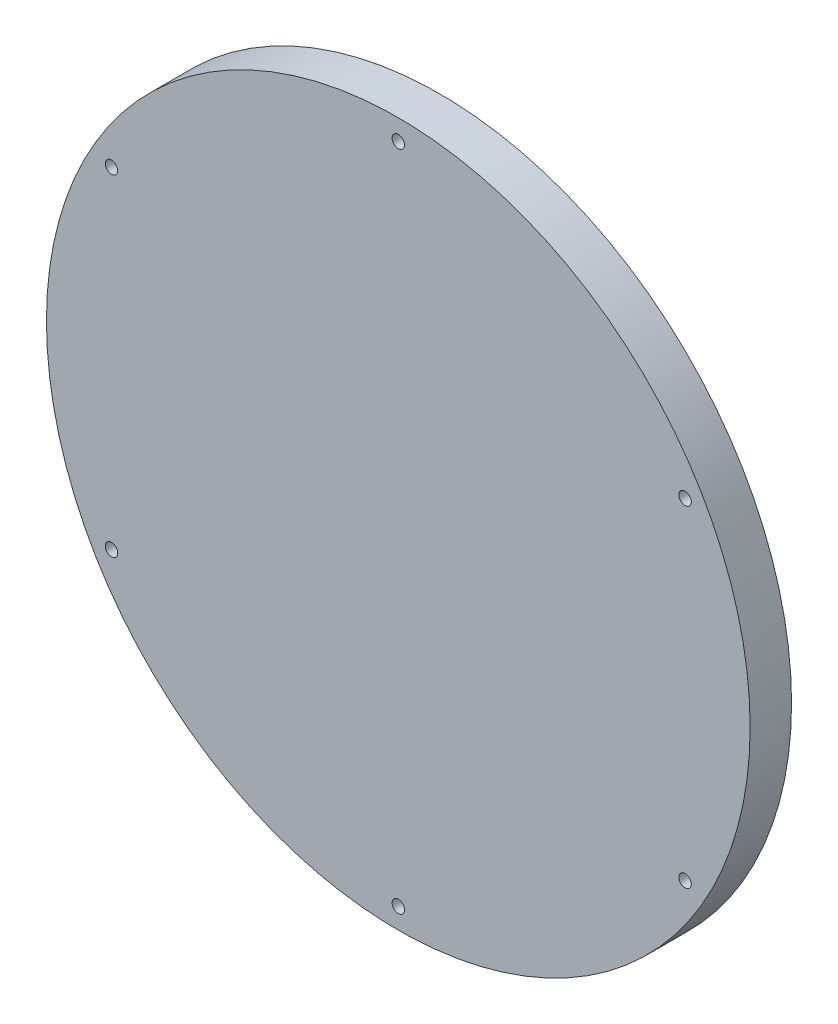
ISO-10303-21;
HEADER;
FILE_DESCRIPTION(('STEP AP214'),'2;1');
FILE_NAME('part.step','',(''),(''),'','','');
FILE_SCHEMA(('AUTOMOTIVE_DESIGN { 1 0 10303 214 1 1 1 1 }'));
ENDSEC;
DATA;
#1=APPLICATION_CONTEXT('core data for automotive mechanical design processes');
#2=APPLICATION_PROTOCOL_DEFINITION('international standard','automotive_design',2000,#1);
#3=PRODUCT_CONTEXT('',#1,'mechanical');
#4=PRODUCT('Part','Part','',(#3));
#5=PRODUCT_RELATED_PRODUCT_CATEGORY('part','',(#4));
#6=PRODUCT_DEFINITION_FORMATION('','',#4);
#7=PRODUCT_DEFINITION_CONTEXT('part definition',#1,'design');
#8=PRODUCT_DEFINITION('design','',#6,#7);
#9=PRODUCT_DEFINITION_SHAPE('','',#8);
#10=(LENGTH_UNIT() NAMED_UNIT(*) SI_UNIT(.MILLI.,.METRE.));
#11=(NAMED_UNIT(*) PLANE_ANGLE_UNIT() SI_UNIT($,.RADIAN.));
#12=(NAMED_UNIT(*) SI_UNIT($,.STERADIAN.) SOLID_ANGLE_UNIT());
#13=UNCERTAINTY_MEASURE_WITH_UNIT(LENGTH_MEASURE(1.E-05),#10,'distance_accuracy_value','');
#14=(GEOMETRIC_REPRESENTATION_CONTEXT(3) GLOBAL_UNCERTAINTY_ASSIGNED_CONTEXT((#13)) GLOBAL_UNIT_ASSIGNED_CONTEXT((#10,
#11,#12)) REPRESENTATION_CONTEXT('',''));
#15=CARTESIAN_POINT('',(0.,0.,0.));
#16=DIRECTION('',(0.,0.,1.));
#17=DIRECTION('',(1.,0.,0.));
#18=AXIS2_PLACEMENT_3D('',#15,#16,#17);
#19=CARTESIAN_POINT('',(0.,0.,0.));
#20=DIRECTION('',(0.,0.,1.));
#21=DIRECTION('',(1.,0.,0.));
#22=AXIS2_PLACEMENT_3D('',#19,#20,#21);
#23=PLANE('',#22);
#24=DIRECTION('',(1.,0.,0.));
#25=VECTOR('',#24,1.);
#26=CARTESIAN_POINT('',(45.,5.,0.));
#27=LINE('',#26,#25);
#28=CARTESIAN_POINT('',(45.,5.,0.));
#29=VERTEX_POINT('',#28);
#30=CARTESIAN_POINT('',(50.,5.,0.));
#31=VERTEX_POINT('',#30);
#32=EDGE_CURVE('E113',#29,#31,#27,.T.);
#33=ORIENTED_EDGE('',*,*,#32,.F.);
#34=DIRECTION('',(0.,-1.,0.));
#35=VECTOR('',#34,1.);
#36=CARTESIAN_POINT('',(45.,5.,0.));
#37=LINE('',#36,#35);
#38=CARTESIAN_POINT('',(45.,-5.,0.));
#39=VERTEX_POINT('',#38);
#40=EDGE_CURVE('E191',#29,#39,#37,.T.);
#41=ORIENTED_EDGE('',*,*,#40,.T.);
#42=DIRECTION('',(1.,0.,0.));
#43=VECTOR('',#42,1.);
#44=CARTESIAN_POINT('',(45.,-5.,0.));
#45=LINE('',#44,#43);
#46=CARTESIAN_POINT('',(50.,-5.,0.));
#47=VERTEX_POINT('',#46);
#48=EDGE_CURVE('E116',#39,#47,#45,.T.);
#49=ORIENTED_EDGE('',*,*,#48,.T.);
#50=DIRECTION('',(0.,-1.,0.));
#51=VECTOR('',#50,1.);
#52=CARTESIAN_POINT('',(50.,5.,0.));
#53=LINE('',#52,#51);
#54=EDGE_CURVE('E192',#31,#47,#53,.T.);
#55=ORIENTED_EDGE('',*,*,#54,.F.);
#56=EDGE_LOOP('',(#33,#41,#49,#55));
#57=FACE_BOUND('',#56,.T.);
#58=CARTESIAN_POINT('',(0.,0.,0.));
#59=DIRECTION('',(0.,0.,1.));
#60=DIRECTION('',(1.,0.,0.));
#61=AXIS2_PLACEMENT_3D('',#58,#59,#60);
#62=CIRCLE('',#61,85.);
#63=CARTESIAN_POINT('',(85.,0.,0.));
#64=VERTEX_POINT('',#63);
#65=EDGE_CURVE('E36',#64,#64,#62,.T.);
#66=ORIENTED_EDGE('',*,*,#65,.F.);
#67=EDGE_LOOP('',(#66));
#68=FACE_BOUND('',#67,.T.);
#69=CARTESIAN_POINT('',(0.,80.,0.));
#70=DIRECTION('',(0.,0.,1.));
#71=DIRECTION('',(1.,0.,0.));
#72=AXIS2_PLACEMENT_3D('',#69,#70,#71);
#73=CIRCLE('',#72,1.5);
#74=CARTESIAN_POINT('',(1.5,80.,0.));
#75=VERTEX_POINT('',#74);
#76=EDGE_CURVE('E152',#75,#75,#73,.T.);
#77=ORIENTED_EDGE('',*,*,#76,.T.);
#78=EDGE_LOOP('',(#77));
#79=FACE_BOUND('',#78,.T.);
#80=CARTESIAN_POINT('',(69.2820323027568,40.000000000003,0.));
#81=DIRECTION('',(0.,0.,1.));
#82=DIRECTION('',(1.,0.,0.));
#83=AXIS2_PLACEMENT_3D('',#80,#81,#82);
#84=CIRCLE('',#83,1.50000000000097);
#85=CARTESIAN_POINT('',(70.7820323027577,40.000000000003,0.));
#86=VERTEX_POINT('',#85);
#87=EDGE_CURVE('E146',#86,#86,#84,.T.);
#88=ORIENTED_EDGE('',*,*,#87,.T.);
#89=EDGE_LOOP('',(#88));
#90=FACE_BOUND('',#89,.T.);
#91=CARTESIAN_POINT('',(69.2820323027602,-39.9999999999971,0.));
#92=DIRECTION('',(0.,0.,1.));
#93=DIRECTION('',(1.,0.,0.));
#94=AXIS2_PLACEMENT_3D('',#91,#92,#93);
#95=CIRCLE('',#94,1.50000000000438);
#96=CARTESIAN_POINT('',(70.7820323027646,-39.9999999999971,0.));
#97=VERTEX_POINT('',#96);
#98=EDGE_CURVE('E140',#97,#97,#95,.T.);
#99=ORIENTED_EDGE('',*,*,#98,.T.);
#100=EDGE_LOOP('',(#99));
#101=FACE_BOUND('',#100,.T.);
#102=CARTESIAN_POINT('',(6.79181874011742E-12,-80.,0.));
#103=DIRECTION('',(0.,0.,1.));
#104=DIRECTION('',(1.,0.,0.));
#105=AXIS2_PLACEMENT_3D('',#102,#103,#104);
#106=CIRCLE('',#105,1.50000000000703);
#107=CARTESIAN_POINT('',(1.50000000001382,-80.,0.));
#108=VERTEX_POINT('',#107);
#109=EDGE_CURVE('E134',#108,#108,#106,.T.);
#110=ORIENTED_EDGE('',*,*,#109,.T.);
#111=EDGE_LOOP('',(#110));
#112=FACE_BOUND('',#111,.T.);
#113=CARTESIAN_POINT('',(-69.28203230275,-40.000000000003,0.));
#114=DIRECTION('',(0.,0.,1.));
#115=DIRECTION('',(1.,0.,0.));
#116=AXIS2_PLACEMENT_3D('',#113,#114,#115);
#117=CIRCLE('',#116,1.50000000000645);
#118=CARTESIAN_POINT('',(-67.7820323027435,-40.000000000003,0.));
#119=VERTEX_POINT('',#118);
#120=EDGE_CURVE('E129',#119,#119,#117,.T.);
#121=ORIENTED_EDGE('',*,*,#120,.T.);
#122=EDGE_LOOP('',(#121));
#123=FACE_BOUND('',#122,.T.);
#124=CARTESIAN_POINT('',(-69.2820323027534,39.999999999997,0.));
#125=DIRECTION('',(0.,0.,1.));
#126=DIRECTION('',(1.,0.,0.));
#127=AXIS2_PLACEMENT_3D('',#124,#125,#126);
#128=CIRCLE('',#127,1.50000000000345);
#129=CARTESIAN_POINT('',(-67.78203230275,39.999999999997,0.));
#130=VERTEX_POINT('',#129);
#131=EDGE_CURVE('E119',#130,#130,#128,.T.);
#132=ORIENTED_EDGE('',*,*,#131,.T.);
#133=EDGE_LOOP('',(#132));
#134=FACE_BOUND('',#133,.T.);
#135=DIRECTION('',(1.,0.,0.));
#136=VECTOR('',#135,1.);
#137=CARTESIAN_POINT('',(-50.,5.,0.));
#138=LINE('',#137,#136);
#139=CARTESIAN_POINT('',(-50.,5.,0.));
#140=VERTEX_POINT('',#139);
#141=CARTESIAN_POINT('',(-45.,5.,0.));
#142=VERTEX_POINT('',#141);
#143=EDGE_CURVE('E227',#140,#142,#138,.T.);
#144=ORIENTED_EDGE('',*,*,#143,.F.);
#145=DIRECTION('',(0.,-1.,0.));
#146=VECTOR('',#145,1.);
#147=CARTESIAN_POINT('',(-50.,5.,0.));
#148=LINE('',#147,#146);
#149=CARTESIAN_POINT('',(-50.,-5.,0.));
#150=VERTEX_POINT('',#149);
#151=EDGE_CURVE('E124',#140,#150,#148,.T.);
#152=ORIENTED_EDGE('',*,*,#151,.T.);
#153=DIRECTION('',(1.,0.,0.));
#154=VECTOR('',#153,1.);
#155=CARTESIAN_POINT('',(-50.,-5.,0.));
#156=LINE('',#155,#154);
#157=CARTESIAN_POINT('',(-45.,-5.,0.));
#158=VERTEX_POINT('',#157);
#159=EDGE_CURVE('E205',#150,#158,#156,.T.);
#160=ORIENTED_EDGE('',*,*,#159,.T.);
#161=DIRECTION('',(0.,-1.,0.));
#162=VECTOR('',#161,1.);
#163=CARTESIAN_POINT('',(-45.,5.,0.));
#164=LINE('',#163,#162);
#165=EDGE_CURVE('E221',#142,#158,#164,.T.);
#166=ORIENTED_EDGE('',*,*,#165,.F.);
#167=EDGE_LOOP('',(#144,#152,#160,#166));
#168=FACE_BOUND('',#167,.T.);
#169=ADVANCED_FACE('F32',(#57,#68,#79,#90,#101,#112,#123,#134,#168),#23,.F.);
#170=CARTESIAN_POINT('',(0.,0.,10.));
#171=DIRECTION('',(0.,0.,1.));
#172=DIRECTION('',(1.,0.,0.));
#173=AXIS2_PLACEMENT_3D('',#170,#171,#172);
#174=PLANE('',#173);
#175=CARTESIAN_POINT('',(-69.28203230275,-40.000000000003,10.));
#176=DIRECTION('',(0.,0.,1.));
#177=DIRECTION('',(1.,0.,0.));
#178=AXIS2_PLACEMENT_3D('',#175,#176,#177);
#179=CIRCLE('',#178,1.50000000000645);
#180=CARTESIAN_POINT('',(-67.7820323027435,-40.000000000003,10.));
#181=VERTEX_POINT('',#180);
#182=EDGE_CURVE('E131',#181,#181,#179,.T.);
#183=ORIENTED_EDGE('',*,*,#182,.F.);
#184=EDGE_LOOP('',(#183));
#185=FACE_BOUND('',#184,.T.);
#186=CARTESIAN_POINT('',(69.2820323027602,-39.9999999999971,10.));
#187=DIRECTION('',(0.,0.,1.));
#188=DIRECTION('',(1.,0.,0.));
#189=AXIS2_PLACEMENT_3D('',#186,#187,#188);
#190=CIRCLE('',#189,1.50000000000438);
#191=CARTESIAN_POINT('',(70.7820323027646,-39.9999999999971,10.));
#192=VERTEX_POINT('',#191);
#193=EDGE_CURVE('E143',#192,#192,#190,.T.);
#194=ORIENTED_EDGE('',*,*,#193,.F.);
#195=EDGE_LOOP('',(#194));
#196=FACE_BOUND('',#195,.T.);
#197=CARTESIAN_POINT('',(0.,80.,10.));
#198=DIRECTION('',(0.,0.,1.));
#199=DIRECTION('',(1.,0.,0.));
#200=AXIS2_PLACEMENT_3D('',#197,#198,#199);
#201=CIRCLE('',#200,1.5);
#202=CARTESIAN_POINT('',(1.5,80.,10.));
#203=VERTEX_POINT('',#202);
#204=EDGE_CURVE('E155',#203,#203,#201,.T.);
#205=ORIENTED_EDGE('',*,*,#204,.F.);
#206=EDGE_LOOP('',(#205));
#207=FACE_BOUND('',#206,.T.);
#208=CARTESIAN_POINT('',(0.,0.,10.));
#209=DIRECTION('',(0.,0.,1.));
#210=DIRECTION('',(1.,0.,0.));
#211=AXIS2_PLACEMENT_3D('',#208,#209,#210);
#212=CIRCLE('',#211,85.);
#213=CARTESIAN_POINT('',(85.,0.,10.));
#214=VERTEX_POINT('',#213);
#215=EDGE_CURVE('E11',#214,#214,#212,.T.);
#216=ORIENTED_EDGE('',*,*,#215,.T.);
#217=EDGE_LOOP('',(#216));
#218=FACE_BOUND('',#217,.T.);
#219=CARTESIAN_POINT('',(69.2820323027568,40.000000000003,10.));
#220=DIRECTION('',(0.,0.,1.));
#221=DIRECTION('',(1.,0.,0.));
#222=AXIS2_PLACEMENT_3D('',#219,#220,#221);
#223=CIRCLE('',#222,1.50000000000097);
#224=CARTESIAN_POINT('',(70.7820323027577,40.000000000003,10.));
#225=VERTEX_POINT('',#224);
#226=EDGE_CURVE('E149',#225,#225,#223,.T.);
#227=ORIENTED_EDGE('',*,*,#226,.F.);
#228=EDGE_LOOP('',(#227));
#229=FACE_BOUND('',#228,.T.);
#230=CARTESIAN_POINT('',(6.79181874011742E-12,-80.,10.));
#231=DIRECTION('',(0.,0.,1.));
#232=DIRECTION('',(1.,0.,0.));
#233=AXIS2_PLACEMENT_3D('',#230,#231,#232);
#234=CIRCLE('',#233,1.50000000000703);
#235=CARTESIAN_POINT('',(1.50000000001382,-80.,10.));
#236=VERTEX_POINT('',#235);
#237=EDGE_CURVE('E137',#236,#236,#234,.T.);
#238=ORIENTED_EDGE('',*,*,#237,.F.);
#239=EDGE_LOOP('',(#238));
#240=FACE_BOUND('',#239,.T.);
#241=CARTESIAN_POINT('',(-69.2820323027534,39.999999999997,10.));
#242=DIRECTION('',(0.,0.,1.));
#243=DIRECTION('',(1.,0.,0.));
#244=AXIS2_PLACEMENT_3D('',#241,#242,#243);
#245=CIRCLE('',#244,1.50000000000345);
#246=CARTESIAN_POINT('',(-67.78203230275,39.999999999997,10.));
#247=VERTEX_POINT('',#246);
#248=EDGE_CURVE('E122',#247,#247,#245,.T.);
#249=ORIENTED_EDGE('',*,*,#248,.F.);
#250=EDGE_LOOP('',(#249));
#251=FACE_BOUND('',#250,.T.);
#252=ADVANCED_FACE('F175',(#185,#196,#207,#218,#229,#240,#251),#174,.T.);
#253=CARTESIAN_POINT('',(0.,0.,10.));
#254=DIRECTION('',(0.,0.,-1.));
#255=DIRECTION('',(-1.,0.,0.));
#256=AXIS2_PLACEMENT_3D('',#253,#254,#255);
#257=CYLINDRICAL_SURFACE('',#256,85.);
#258=ORIENTED_EDGE('',*,*,#215,.F.);
#259=EDGE_LOOP('',(#258));
#260=FACE_BOUND('',#259,.T.);
#261=ORIENTED_EDGE('',*,*,#65,.T.);
#262=EDGE_LOOP('',(#261));
#263=FACE_BOUND('',#262,.T.);
#264=ADVANCED_FACE('F34',(#260,#263),#257,.T.);
#265=CARTESIAN_POINT('',(0.,80.,10.));
#266=DIRECTION('',(0.,0.,-1.));
#267=DIRECTION('',(-1.,0.,0.));
#268=AXIS2_PLACEMENT_3D('',#265,#266,#267);
#269=CYLINDRICAL_SURFACE('',#268,1.5);
#270=ORIENTED_EDGE('',*,*,#204,.T.);
#271=EDGE_LOOP('',(#270));
#272=FACE_BOUND('',#271,.T.);
#273=ORIENTED_EDGE('',*,*,#76,.F.);
#274=EDGE_LOOP('',(#273));
#275=FACE_BOUND('',#274,.T.);
#276=ADVANCED_FACE('F163',(#272,#275),#269,.F.);
#277=CARTESIAN_POINT('',(69.2820323027568,40.000000000003,10.));
#278=DIRECTION('',(0.,0.,-1.));
#279=DIRECTION('',(-1.,0.,0.));
#280=AXIS2_PLACEMENT_3D('',#277,#278,#279);
#281=CYLINDRICAL_SURFACE('',#280,1.50000000000097);
#282=ORIENTED_EDGE('',*,*,#226,.T.);
#283=EDGE_LOOP('',(#282));
#284=FACE_BOUND('',#283,.T.);
#285=ORIENTED_EDGE('',*,*,#87,.F.);
#286=EDGE_LOOP('',(#285));
#287=FACE_BOUND('',#286,.T.);
#288=ADVANCED_FACE('F165',(#284,#287),#281,.F.);
#289=CARTESIAN_POINT('',(69.2820323027602,-39.9999999999971,10.));
#290=DIRECTION('',(0.,0.,-1.));
#291=DIRECTION('',(-1.,0.,0.));
#292=AXIS2_PLACEMENT_3D('',#289,#290,#291);
#293=CYLINDRICAL_SURFACE('',#292,1.50000000000438);
#294=ORIENTED_EDGE('',*,*,#193,.T.);
#295=EDGE_LOOP('',(#294));
#296=FACE_BOUND('',#295,.T.);
#297=ORIENTED_EDGE('',*,*,#98,.F.);
#298=EDGE_LOOP('',(#297));
#299=FACE_BOUND('',#298,.T.);
#300=ADVANCED_FACE('F172',(#296,#299),#293,.F.);
#301=CARTESIAN_POINT('',(6.79181874011742E-12,-80.,10.));
#302=DIRECTION('',(0.,0.,-1.));
#303=DIRECTION('',(-1.,0.,0.));
#304=AXIS2_PLACEMENT_3D('',#301,#302,#303);
#305=CYLINDRICAL_SURFACE('',#304,1.50000000000703);
#306=ORIENTED_EDGE('',*,*,#237,.T.);
#307=EDGE_LOOP('',(#306));
#308=FACE_BOUND('',#307,.T.);
#309=ORIENTED_EDGE('',*,*,#109,.F.);
#310=EDGE_LOOP('',(#309));
#311=FACE_BOUND('',#310,.T.);
#312=ADVANCED_FACE('F264',(#308,#311),#305,.F.);
#313=CARTESIAN_POINT('',(-69.28203230275,-40.000000000003,10.));
#314=DIRECTION('',(0.,0.,-1.));
#315=DIRECTION('',(-1.,0.,0.));
#316=AXIS2_PLACEMENT_3D('',#313,#314,#315);
#317=CYLINDRICAL_SURFACE('',#316,1.50000000000645);
#318=ORIENTED_EDGE('',*,*,#182,.T.);
#319=EDGE_LOOP('',(#318));
#320=FACE_BOUND('',#319,.T.);
#321=ORIENTED_EDGE('',*,*,#120,.F.);
#322=EDGE_LOOP('',(#321));
#323=FACE_BOUND('',#322,.T.);
#324=ADVANCED_FACE('F260',(#320,#323),#317,.F.);
#325=CARTESIAN_POINT('',(-69.2820323027534,39.999999999997,10.));
#326=DIRECTION('',(0.,0.,-1.));
#327=DIRECTION('',(-1.,0.,0.));
#328=AXIS2_PLACEMENT_3D('',#325,#326,#327);
#329=CYLINDRICAL_SURFACE('',#328,1.50000000000345);
#330=ORIENTED_EDGE('',*,*,#248,.T.);
#331=EDGE_LOOP('',(#330));
#332=FACE_BOUND('',#331,.T.);
#333=ORIENTED_EDGE('',*,*,#131,.F.);
#334=EDGE_LOOP('',(#333));
#335=FACE_BOUND('',#334,.T.);
#336=ADVANCED_FACE('F257',(#332,#335),#329,.F.);
#337=CARTESIAN_POINT('',(50.,5.,0.));
#338=DIRECTION('',(-1.,0.,0.));
#339=DIRECTION('',(0.,0.,1.));
#340=AXIS2_PLACEMENT_3D('',#337,#338,#339);
#341=PLANE('',#340);
#342=DIRECTION('',(0.,0.,-1.));
#343=VECTOR('',#342,1.);
#344=CARTESIAN_POINT('',(50.,-5.,0.));
#345=LINE('',#344,#343);
#346=CARTESIAN_POINT('',(50.,-5.,-4.));
#347=VERTEX_POINT('',#346);
#348=EDGE_CURVE('E54',#47,#347,#345,.T.);
#349=ORIENTED_EDGE('',*,*,#348,.T.);
#350=DIRECTION('',(0.,-1.,0.));
#351=VECTOR('',#350,1.);
#352=CARTESIAN_POINT('',(50.,5.,-4.));
#353=LINE('',#352,#351);
#354=CARTESIAN_POINT('',(50.,5.,-4.));
#355=VERTEX_POINT('',#354);
#356=EDGE_CURVE('E102',#355,#347,#353,.T.);
#357=ORIENTED_EDGE('',*,*,#356,.F.);
#358=DIRECTION('',(0.,0.,-1.));
#359=VECTOR('',#358,1.);
#360=CARTESIAN_POINT('',(50.,5.,0.));
#361=LINE('',#360,#359);
#362=EDGE_CURVE('E108',#31,#355,#361,.T.);
#363=ORIENTED_EDGE('',*,*,#362,.F.);
#364=ORIENTED_EDGE('',*,*,#54,.T.);
#365=EDGE_LOOP('',(#349,#357,#363,#364));
#366=FACE_BOUND('',#365,.T.);
#367=ADVANCED_FACE('F118',(#366),#341,.F.);
#368=CARTESIAN_POINT('',(-50.,5.,-4.));
#369=DIRECTION('',(0.,0.,1.));
#370=DIRECTION('',(1.,0.,0.));
#371=AXIS2_PLACEMENT_3D('',#368,#369,#370);
#372=PLANE('',#371);
#373=DIRECTION('',(-1.,0.,0.));
#374=VECTOR('',#373,1.);
#375=CARTESIAN_POINT('',(-50.,-5.,-4.));
#376=LINE('',#375,#374);
#377=CARTESIAN_POINT('',(-50.,-5.,-4.));
#378=VERTEX_POINT('',#377);
#379=EDGE_CURVE('E201',#347,#378,#376,.T.);
#380=ORIENTED_EDGE('',*,*,#379,.T.);
#381=DIRECTION('',(0.,-1.,0.));
#382=VECTOR('',#381,1.);
#383=CARTESIAN_POINT('',(-50.,5.,-4.));
#384=LINE('',#383,#382);
#385=CARTESIAN_POINT('',(-50.,5.,-4.));
#386=VERTEX_POINT('',#385);
#387=EDGE_CURVE('E104',#386,#378,#384,.T.);
#388=ORIENTED_EDGE('',*,*,#387,.F.);
#389=DIRECTION('',(-1.,0.,0.));
#390=VECTOR('',#389,1.);
#391=CARTESIAN_POINT('',(-50.,5.,-4.));
#392=LINE('',#391,#390);
#393=EDGE_CURVE('E98',#355,#386,#392,.T.);
#394=ORIENTED_EDGE('',*,*,#393,.F.);
#395=ORIENTED_EDGE('',*,*,#356,.T.);
#396=EDGE_LOOP('',(#380,#388,#394,#395));
#397=FACE_BOUND('',#396,.T.);
#398=ADVANCED_FACE('F100',(#397),#372,.F.);
#399=CARTESIAN_POINT('',(-50.,5.,0.));
#400=DIRECTION('',(1.,0.,0.));
#401=DIRECTION('',(0.,0.,-1.));
#402=AXIS2_PLACEMENT_3D('',#399,#400,#401);
#403=PLANE('',#402);
#404=DIRECTION('',(0.,0.,1.));
#405=VECTOR('',#404,1.);
#406=CARTESIAN_POINT('',(-50.,-5.,0.));
#407=LINE('',#406,#405);
#408=EDGE_CURVE('E203',#378,#150,#407,.T.);
#409=ORIENTED_EDGE('',*,*,#408,.T.);
#410=ORIENTED_EDGE('',*,*,#151,.F.);
#411=DIRECTION('',(0.,0.,1.));
#412=VECTOR('',#411,1.);
#413=CARTESIAN_POINT('',(-50.,5.,0.));
#414=LINE('',#413,#412);
#415=EDGE_CURVE('E107',#386,#140,#414,.T.);
#416=ORIENTED_EDGE('',*,*,#415,.F.);
#417=ORIENTED_EDGE('',*,*,#387,.T.);
#418=EDGE_LOOP('',(#409,#410,#416,#417));
#419=FACE_BOUND('',#418,.T.);
#420=ADVANCED_FACE('F229',(#419),#403,.F.);
#421=CARTESIAN_POINT('',(-45.,5.,-2.));
#422=DIRECTION('',(-1.,0.,0.));
#423=DIRECTION('',(0.,0.,1.));
#424=AXIS2_PLACEMENT_3D('',#421,#422,#423);
#425=PLANE('',#424);
#426=DIRECTION('',(0.,0.,-1.));
#427=VECTOR('',#426,1.);
#428=CARTESIAN_POINT('',(-45.,-5.,-2.));
#429=LINE('',#428,#427);
#430=CARTESIAN_POINT('',(-45.,-5.,-2.));
#431=VERTEX_POINT('',#430);
#432=EDGE_CURVE('E47',#158,#431,#429,.T.);
#433=ORIENTED_EDGE('',*,*,#432,.T.);
#434=DIRECTION('',(0.,-1.,0.));
#435=VECTOR('',#434,1.);
#436=CARTESIAN_POINT('',(-45.,5.,-2.));
#437=LINE('',#436,#435);
#438=CARTESIAN_POINT('',(-45.,5.,-2.));
#439=VERTEX_POINT('',#438);
#440=EDGE_CURVE('E218',#439,#431,#437,.T.);
#441=ORIENTED_EDGE('',*,*,#440,.F.);
#442=DIRECTION('',(0.,0.,-1.));
#443=VECTOR('',#442,1.);
#444=CARTESIAN_POINT('',(-45.,5.,-2.));
#445=LINE('',#444,#443);
#446=EDGE_CURVE('E400',#142,#439,#445,.T.);
#447=ORIENTED_EDGE('',*,*,#446,.F.);
#448=ORIENTED_EDGE('',*,*,#165,.T.);
#449=EDGE_LOOP('',(#433,#441,#447,#448));
#450=FACE_BOUND('',#449,.T.);
#451=ADVANCED_FACE('F246',(#450),#425,.F.);
#452=CARTESIAN_POINT('',(-45.,5.,-2.));
#453=DIRECTION('',(0.,0.,-1.));
#454=DIRECTION('',(-1.,0.,0.));
#455=AXIS2_PLACEMENT_3D('',#452,#453,#454);
#456=PLANE('',#455);
#457=DIRECTION('',(1.,0.,0.));
#458=VECTOR('',#457,1.);
#459=CARTESIAN_POINT('',(-45.,-5.,-2.));
#460=LINE('',#459,#458);
#461=CARTESIAN_POINT('',(45.,-5.,-2.));
#462=VERTEX_POINT('',#461);
#463=EDGE_CURVE('E209',#431,#462,#460,.T.);
#464=ORIENTED_EDGE('',*,*,#463,.T.);
#465=DIRECTION('',(0.,-1.,0.));
#466=VECTOR('',#465,1.);
#467=CARTESIAN_POINT('',(45.,5.,-2.));
#468=LINE('',#467,#466);
#469=CARTESIAN_POINT('',(45.,5.,-2.));
#470=VERTEX_POINT('',#469);
#471=EDGE_CURVE('E215',#470,#462,#468,.T.);
#472=ORIENTED_EDGE('',*,*,#471,.F.);
#473=DIRECTION('',(1.,0.,0.));
#474=VECTOR('',#473,1.);
#475=CARTESIAN_POINT('',(-45.,5.,-2.));
#476=LINE('',#475,#474);
#477=EDGE_CURVE('E196',#439,#470,#476,.T.);
#478=ORIENTED_EDGE('',*,*,#477,.F.);
#479=ORIENTED_EDGE('',*,*,#440,.T.);
#480=EDGE_LOOP('',(#464,#472,#478,#479));
#481=FACE_BOUND('',#480,.T.);
#482=ADVANCED_FACE('F242',(#481),#456,.F.);
#483=CARTESIAN_POINT('',(45.,5.,-2.));
#484=DIRECTION('',(1.,0.,0.));
#485=DIRECTION('',(0.,0.,-1.));
#486=AXIS2_PLACEMENT_3D('',#483,#484,#485);
#487=PLANE('',#486);
#488=DIRECTION('',(0.,0.,1.));
#489=VECTOR('',#488,1.);
#490=CARTESIAN_POINT('',(45.,-5.,-2.));
#491=LINE('',#490,#489);
#492=EDGE_CURVE('E211',#462,#39,#491,.T.);
#493=ORIENTED_EDGE('',*,*,#492,.T.);
#494=ORIENTED_EDGE('',*,*,#40,.F.);
#495=DIRECTION('',(0.,0.,1.));
#496=VECTOR('',#495,1.);
#497=CARTESIAN_POINT('',(45.,5.,-2.));
#498=LINE('',#497,#496);
#499=EDGE_CURVE('E193',#470,#29,#498,.T.);
#500=ORIENTED_EDGE('',*,*,#499,.F.);
#501=ORIENTED_EDGE('',*,*,#471,.T.);
#502=EDGE_LOOP('',(#493,#494,#500,#501));
#503=FACE_BOUND('',#502,.T.);
#504=ADVANCED_FACE('F237',(#503),#487,.F.);
#505=CARTESIAN_POINT('',(0.,5.,0.));
#506=DIRECTION('',(0.,-1.,0.));
#507=DIRECTION('',(0.,0.,-1.));
#508=AXIS2_PLACEMENT_3D('',#505,#506,#507);
#509=PLANE('',#508);
#510=ORIENTED_EDGE('',*,*,#362,.T.);
#511=ORIENTED_EDGE('',*,*,#393,.T.);
#512=ORIENTED_EDGE('',*,*,#415,.T.);
#513=ORIENTED_EDGE('',*,*,#143,.T.);
#514=ORIENTED_EDGE('',*,*,#446,.T.);
#515=ORIENTED_EDGE('',*,*,#477,.T.);
#516=ORIENTED_EDGE('',*,*,#499,.T.);
#517=ORIENTED_EDGE('',*,*,#32,.T.);
#518=EDGE_LOOP('',(#510,#511,#512,#513,#514,#515,#516,#517));
#519=FACE_BOUND('',#518,.T.);
#520=ADVANCED_FACE('F111',(#519),#509,.F.);
#521=CARTESIAN_POINT('',(0.,-5.,0.));
#522=DIRECTION('',(0.,-1.,0.));
#523=DIRECTION('',(0.,0.,-1.));
#524=AXIS2_PLACEMENT_3D('',#521,#522,#523);
#525=PLANE('',#524);
#526=ORIENTED_EDGE('',*,*,#348,.F.);
#527=ORIENTED_EDGE('',*,*,#48,.F.);
#528=ORIENTED_EDGE('',*,*,#492,.F.);
#529=ORIENTED_EDGE('',*,*,#463,.F.);
#530=ORIENTED_EDGE('',*,*,#432,.F.);
#531=ORIENTED_EDGE('',*,*,#159,.F.);
#532=ORIENTED_EDGE('',*,*,#408,.F.);
#533=ORIENTED_EDGE('',*,*,#379,.F.);
#534=EDGE_LOOP('',(#526,#527,#528,#529,#530,#531,#532,#533));
#535=FACE_BOUND('',#534,.T.);
#536=ADVANCED_FACE('F231',(#535),#525,.T.);
#537=CLOSED_SHELL('',(#169,#252,#264,#276,#288,#300,#312,#324,#336,#367,#398,#420,#451,#482,
#504,#520,#536));
#538=MANIFOLD_SOLID_BREP('B2',#537);
#539=ADVANCED_BREP_SHAPE_REPRESENTATION('',(#18,#538),#14);
#540=SHAPE_DEFINITION_REPRESENTATION(#9,#539);
ENDSEC;
END-ISO-10303-21;
